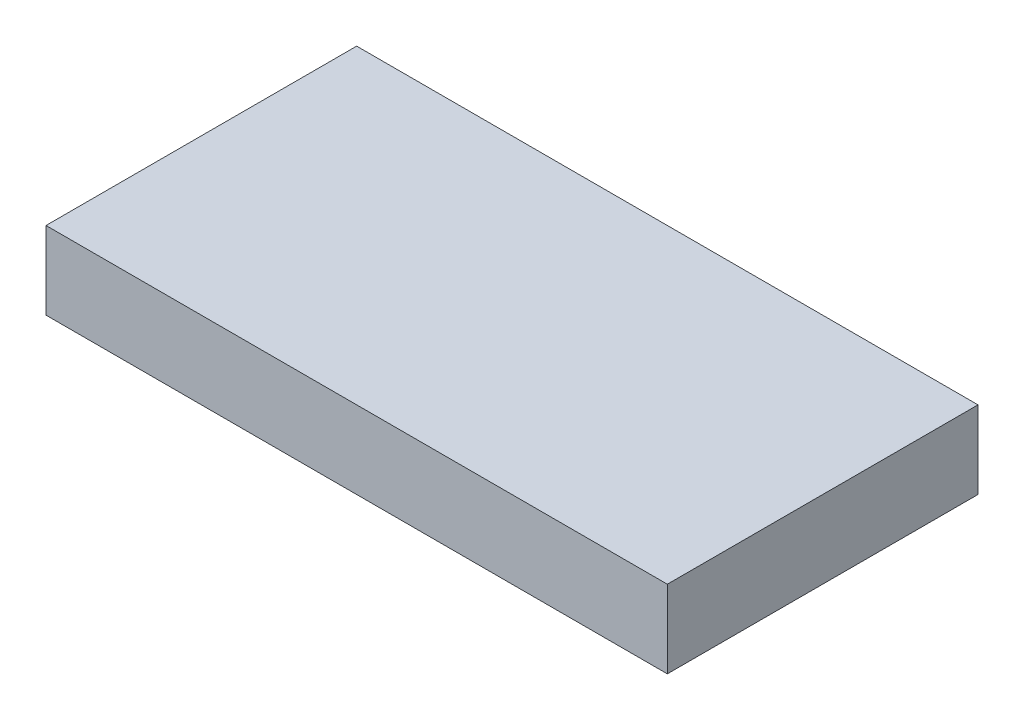
ISO-10303-21;
HEADER;
FILE_DESCRIPTION(('STEP AP214'),'2;1');
FILE_NAME('part.step','',(''),(''),'','','');
FILE_SCHEMA(('AUTOMOTIVE_DESIGN { 1 0 10303 214 1 1 1 1 }'));
ENDSEC;
DATA;
#1=APPLICATION_CONTEXT('core data for automotive mechanical design processes');
#2=APPLICATION_PROTOCOL_DEFINITION('international standard','automotive_design',2000,#1);
#3=PRODUCT_CONTEXT('',#1,'mechanical');
#4=PRODUCT('Part','Part','',(#3));
#5=PRODUCT_RELATED_PRODUCT_CATEGORY('part','',(#4));
#6=PRODUCT_DEFINITION_FORMATION('','',#4);
#7=PRODUCT_DEFINITION_CONTEXT('part definition',#1,'design');
#8=PRODUCT_DEFINITION('design','',#6,#7);
#9=PRODUCT_DEFINITION_SHAPE('','',#8);
#10=(LENGTH_UNIT() NAMED_UNIT(*) SI_UNIT(.MILLI.,.METRE.));
#11=(NAMED_UNIT(*) PLANE_ANGLE_UNIT() SI_UNIT($,.RADIAN.));
#12=(NAMED_UNIT(*) SI_UNIT($,.STERADIAN.) SOLID_ANGLE_UNIT());
#13=UNCERTAINTY_MEASURE_WITH_UNIT(LENGTH_MEASURE(1.E-05),#10,'distance_accuracy_value','');
#14=(GEOMETRIC_REPRESENTATION_CONTEXT(3) GLOBAL_UNCERTAINTY_ASSIGNED_CONTEXT((#13)) GLOBAL_UNIT_ASSIGNED_CONTEXT((#10,
#11,#12)) REPRESENTATION_CONTEXT('',''));
#15=CARTESIAN_POINT('',(0.,0.,0.));
#16=DIRECTION('',(0.,0.,1.));
#17=DIRECTION('',(1.,0.,0.));
#18=AXIS2_PLACEMENT_3D('',#15,#16,#17);
#19=CARTESIAN_POINT('',(0.,63.5,0.));
#20=DIRECTION('',(1.,0.,0.));
#21=DIRECTION('',(0.,0.,-1.));
#22=AXIS2_PLACEMENT_3D('',#19,#20,#21);
#23=PLANE('',#22);
#24=DIRECTION('',(0.,0.,1.));
#25=VECTOR('',#24,1.);
#26=CARTESIAN_POINT('',(0.,0.,0.));
#27=LINE('',#26,#25);
#28=CARTESIAN_POINT('',(0.,0.,-254.));
#29=VERTEX_POINT('',#28);
#30=CARTESIAN_POINT('',(0.,0.,0.));
#31=VERTEX_POINT('',#30);
#32=EDGE_CURVE('E96',#29,#31,#27,.T.);
#33=ORIENTED_EDGE('',*,*,#32,.T.);
#34=DIRECTION('',(0.,-1.,0.));
#35=VECTOR('',#34,1.);
#36=CARTESIAN_POINT('',(0.,63.5,0.));
#37=LINE('',#36,#35);
#38=CARTESIAN_POINT('',(0.,63.5,0.));
#39=VERTEX_POINT('',#38);
#40=EDGE_CURVE('E11',#39,#31,#37,.T.);
#41=ORIENTED_EDGE('',*,*,#40,.F.);
#42=DIRECTION('',(0.,0.,1.));
#43=VECTOR('',#42,1.);
#44=CARTESIAN_POINT('',(0.,63.5,0.));
#45=LINE('',#44,#43);
#46=CARTESIAN_POINT('',(0.,63.5,-254.));
#47=VERTEX_POINT('',#46);
#48=EDGE_CURVE('E84',#47,#39,#45,.T.);
#49=ORIENTED_EDGE('',*,*,#48,.F.);
#50=DIRECTION('',(0.,-1.,0.));
#51=VECTOR('',#50,1.);
#52=CARTESIAN_POINT('',(0.,63.5,-254.));
#53=LINE('',#52,#51);
#54=EDGE_CURVE('E92',#47,#29,#53,.T.);
#55=ORIENTED_EDGE('',*,*,#54,.T.);
#56=EDGE_LOOP('',(#33,#41,#49,#55));
#57=FACE_BOUND('',#56,.T.);
#58=ADVANCED_FACE('F33',(#57),#23,.F.);
#59=CARTESIAN_POINT('',(0.,63.5,0.));
#60=DIRECTION('',(0.,0.,-1.));
#61=DIRECTION('',(-1.,0.,0.));
#62=AXIS2_PLACEMENT_3D('',#59,#60,#61);
#63=PLANE('',#62);
#64=DIRECTION('',(1.,0.,0.));
#65=VECTOR('',#64,1.);
#66=CARTESIAN_POINT('',(0.,0.,0.));
#67=LINE('',#66,#65);
#68=CARTESIAN_POINT('',(508.,0.,0.));
#69=VERTEX_POINT('',#68);
#70=EDGE_CURVE('E88',#31,#69,#67,.T.);
#71=ORIENTED_EDGE('',*,*,#70,.T.);
#72=DIRECTION('',(0.,-1.,0.));
#73=VECTOR('',#72,1.);
#74=CARTESIAN_POINT('',(508.,63.5,0.));
#75=LINE('',#74,#73);
#76=CARTESIAN_POINT('',(508.,63.5,0.));
#77=VERTEX_POINT('',#76);
#78=EDGE_CURVE('E41',#77,#69,#75,.T.);
#79=ORIENTED_EDGE('',*,*,#78,.F.);
#80=DIRECTION('',(1.,0.,0.));
#81=VECTOR('',#80,1.);
#82=CARTESIAN_POINT('',(0.,63.5,0.));
#83=LINE('',#82,#81);
#84=EDGE_CURVE('E79',#39,#77,#83,.T.);
#85=ORIENTED_EDGE('',*,*,#84,.F.);
#86=ORIENTED_EDGE('',*,*,#40,.T.);
#87=EDGE_LOOP('',(#71,#79,#85,#86));
#88=FACE_BOUND('',#87,.T.);
#89=ADVANCED_FACE('F87',(#88),#63,.F.);
#90=CARTESIAN_POINT('',(508.,63.5,0.));
#91=DIRECTION('',(-1.,0.,0.));
#92=DIRECTION('',(0.,0.,1.));
#93=AXIS2_PLACEMENT_3D('',#90,#91,#92);
#94=PLANE('',#93);
#95=DIRECTION('',(0.,0.,-1.));
#96=VECTOR('',#95,1.);
#97=CARTESIAN_POINT('',(508.,0.,0.));
#98=LINE('',#97,#96);
#99=CARTESIAN_POINT('',(508.,0.,-254.));
#100=VERTEX_POINT('',#99);
#101=EDGE_CURVE('E66',#69,#100,#98,.T.);
#102=ORIENTED_EDGE('',*,*,#101,.T.);
#103=DIRECTION('',(0.,-1.,0.));
#104=VECTOR('',#103,1.);
#105=CARTESIAN_POINT('',(508.,63.5,-254.));
#106=LINE('',#105,#104);
#107=CARTESIAN_POINT('',(508.,63.5,-254.));
#108=VERTEX_POINT('',#107);
#109=EDGE_CURVE('E89',#108,#100,#106,.T.);
#110=ORIENTED_EDGE('',*,*,#109,.F.);
#111=DIRECTION('',(0.,0.,-1.));
#112=VECTOR('',#111,1.);
#113=CARTESIAN_POINT('',(508.,63.5,0.));
#114=LINE('',#113,#112);
#115=EDGE_CURVE('E82',#77,#108,#114,.T.);
#116=ORIENTED_EDGE('',*,*,#115,.F.);
#117=ORIENTED_EDGE('',*,*,#78,.T.);
#118=EDGE_LOOP('',(#102,#110,#116,#117));
#119=FACE_BOUND('',#118,.T.);
#120=ADVANCED_FACE('F90',(#119),#94,.F.);
#121=CARTESIAN_POINT('',(0.,63.5,-254.));
#122=DIRECTION('',(0.,0.,1.));
#123=DIRECTION('',(1.,0.,0.));
#124=AXIS2_PLACEMENT_3D('',#121,#122,#123);
#125=PLANE('',#124);
#126=DIRECTION('',(-1.,0.,0.));
#127=VECTOR('',#126,1.);
#128=CARTESIAN_POINT('',(0.,0.,-254.));
#129=LINE('',#128,#127);
#130=EDGE_CURVE('E72',#100,#29,#129,.T.);
#131=ORIENTED_EDGE('',*,*,#130,.T.);
#132=ORIENTED_EDGE('',*,*,#54,.F.);
#133=DIRECTION('',(-1.,0.,0.));
#134=VECTOR('',#133,1.);
#135=CARTESIAN_POINT('',(0.,63.5,-254.));
#136=LINE('',#135,#134);
#137=EDGE_CURVE('E49',#108,#47,#136,.T.);
#138=ORIENTED_EDGE('',*,*,#137,.F.);
#139=ORIENTED_EDGE('',*,*,#109,.T.);
#140=EDGE_LOOP('',(#131,#132,#138,#139));
#141=FACE_BOUND('',#140,.T.);
#142=ADVANCED_FACE('F103',(#141),#125,.F.);
#143=CARTESIAN_POINT('',(0.,63.5,0.));
#144=DIRECTION('',(0.,-1.,0.));
#145=DIRECTION('',(0.,0.,-1.));
#146=AXIS2_PLACEMENT_3D('',#143,#144,#145);
#147=PLANE('',#146);
#148=ORIENTED_EDGE('',*,*,#48,.T.);
#149=ORIENTED_EDGE('',*,*,#84,.T.);
#150=ORIENTED_EDGE('',*,*,#115,.T.);
#151=ORIENTED_EDGE('',*,*,#137,.T.);
#152=EDGE_LOOP('',(#148,#149,#150,#151));
#153=FACE_BOUND('',#152,.T.);
#154=ADVANCED_FACE('F80',(#153),#147,.F.);
#155=CARTESIAN_POINT('',(0.,0.,0.));
#156=DIRECTION('',(0.,-1.,0.));
#157=DIRECTION('',(0.,0.,-1.));
#158=AXIS2_PLACEMENT_3D('',#155,#156,#157);
#159=PLANE('',#158);
#160=ORIENTED_EDGE('',*,*,#32,.F.);
#161=ORIENTED_EDGE('',*,*,#130,.F.);
#162=ORIENTED_EDGE('',*,*,#101,.F.);
#163=ORIENTED_EDGE('',*,*,#70,.F.);
#164=EDGE_LOOP('',(#160,#161,#162,#163));
#165=FACE_BOUND('',#164,.T.);
#166=ADVANCED_FACE('F106',(#165),#159,.T.);
#167=CLOSED_SHELL('',(#58,#89,#120,#142,#154,#166));
#168=MANIFOLD_SOLID_BREP('B2',#167);
#169=ADVANCED_BREP_SHAPE_REPRESENTATION('',(#18,#168),#14);
#170=SHAPE_DEFINITION_REPRESENTATION(#9,#169);
ENDSEC;
END-ISO-10303-21;
